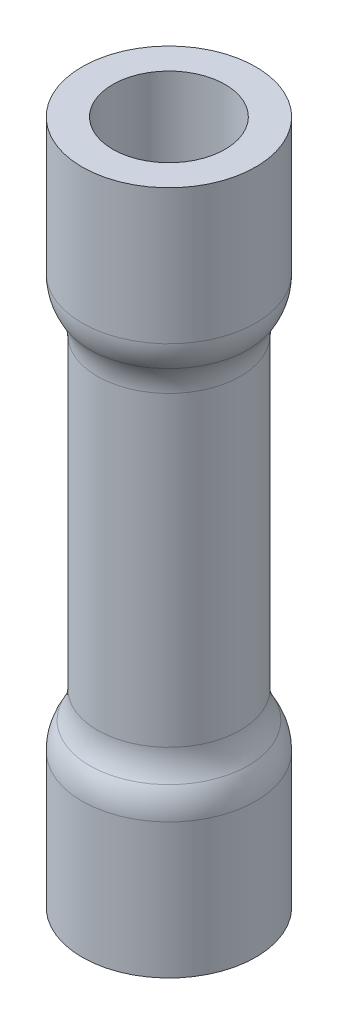
ISO-10303-21;
HEADER;
FILE_DESCRIPTION(('STEP AP214'),'2;1');
FILE_NAME('part.step','',(''),(''),'','','');
FILE_SCHEMA(('AUTOMOTIVE_DESIGN { 1 0 10303 214 1 1 1 1 }'));
ENDSEC;
DATA;
#1=APPLICATION_CONTEXT('core data for automotive mechanical design processes');
#2=APPLICATION_PROTOCOL_DEFINITION('international standard','automotive_design',2000,#1);
#3=PRODUCT_CONTEXT('',#1,'mechanical');
#4=PRODUCT('Part','Part','',(#3));
#5=PRODUCT_RELATED_PRODUCT_CATEGORY('part','',(#4));
#6=PRODUCT_DEFINITION_FORMATION('','',#4);
#7=PRODUCT_DEFINITION_CONTEXT('part definition',#1,'design');
#8=PRODUCT_DEFINITION('design','',#6,#7);
#9=PRODUCT_DEFINITION_SHAPE('','',#8);
#10=(LENGTH_UNIT() NAMED_UNIT(*) SI_UNIT(.MILLI.,.METRE.));
#11=(NAMED_UNIT(*) PLANE_ANGLE_UNIT() SI_UNIT($,.RADIAN.));
#12=(NAMED_UNIT(*) SI_UNIT($,.STERADIAN.) SOLID_ANGLE_UNIT());
#13=UNCERTAINTY_MEASURE_WITH_UNIT(LENGTH_MEASURE(1.E-05),#10,'distance_accuracy_value','');
#14=(GEOMETRIC_REPRESENTATION_CONTEXT(3) GLOBAL_UNCERTAINTY_ASSIGNED_CONTEXT((#13)) GLOBAL_UNIT_ASSIGNED_CONTEXT((#10,
#11,#12)) REPRESENTATION_CONTEXT('',''));
#15=CARTESIAN_POINT('',(0.,0.,0.));
#16=DIRECTION('',(0.,0.,1.));
#17=DIRECTION('',(1.,0.,0.));
#18=AXIS2_PLACEMENT_3D('',#15,#16,#17);
#19=CARTESIAN_POINT('',(0.,17.018,0.));
#20=DIRECTION('',(0.,1.,0.));
#21=DIRECTION('',(0.,0.,1.));
#22=AXIS2_PLACEMENT_3D('',#19,#20,#21);
#23=CYLINDRICAL_SURFACE('',#22,1.016);
#24=CARTESIAN_POINT('',(0.,12.319,0.));
#25=DIRECTION('',(0.,1.,0.));
#26=DIRECTION('',(0.,0.,1.));
#27=AXIS2_PLACEMENT_3D('',#24,#25,#26);
#28=CIRCLE('',#27,1.016);
#29=CARTESIAN_POINT('',(0.,12.319,1.016));
#30=VERTEX_POINT('',#29);
#31=EDGE_CURVE('E114',#30,#30,#28,.F.);
#32=ORIENTED_EDGE('',*,*,#31,.F.);
#33=EDGE_LOOP('',(#32));
#34=FACE_BOUND('',#33,.T.);
#35=CARTESIAN_POINT('',(0.,4.699,0.));
#36=DIRECTION('',(0.,1.,0.));
#37=DIRECTION('',(0.,0.,1.));
#38=AXIS2_PLACEMENT_3D('',#35,#36,#37);
#39=CIRCLE('',#38,1.016);
#40=CARTESIAN_POINT('',(0.,4.699,1.016));
#41=VERTEX_POINT('',#40);
#42=EDGE_CURVE('E117',#41,#41,#39,.T.);
#43=ORIENTED_EDGE('',*,*,#42,.F.);
#44=EDGE_LOOP('',(#43));
#45=FACE_BOUND('',#44,.T.);
#46=ADVANCED_FACE('F12',(#34,#45),#23,.F.);
#47=CARTESIAN_POINT('',(0.,4.699,0.));
#48=DIRECTION('',(0.,1.,0.));
#49=DIRECTION('',(0.,0.,1.));
#50=AXIS2_PLACEMENT_3D('',#47,#48,#49);
#51=TOROIDAL_SURFACE('',#50,3.048,2.032);
#52=ORIENTED_EDGE('',*,*,#42,.T.);
#53=EDGE_LOOP('',(#52));
#54=FACE_BOUND('',#53,.T.);
#55=CARTESIAN_POINT('',(0.,3.62857757871017,0.));
#56=DIRECTION('',(0.,1.,0.));
#57=DIRECTION('',(0.,0.,1.));
#58=AXIS2_PLACEMENT_3D('',#55,#56,#57);
#59=CIRCLE('',#58,1.3208);
#60=CARTESIAN_POINT('',(0.,3.62857757871017,1.3208));
#61=VERTEX_POINT('',#60);
#62=EDGE_CURVE('E113',#61,#61,#59,.F.);
#63=ORIENTED_EDGE('',*,*,#62,.T.);
#64=EDGE_LOOP('',(#63));
#65=FACE_BOUND('',#64,.T.);
#66=ADVANCED_FACE('F106',(#54,#65),#51,.T.);
#67=CARTESIAN_POINT('',(0.,12.319,0.));
#68=DIRECTION('',(0.,1.,0.));
#69=DIRECTION('',(0.,0.,1.));
#70=AXIS2_PLACEMENT_3D('',#67,#68,#69);
#71=TOROIDAL_SURFACE('',#70,3.048,2.032);
#72=CARTESIAN_POINT('',(0.,13.3894224212898,0.));
#73=DIRECTION('',(0.,1.,0.));
#74=DIRECTION('',(0.,0.,1.));
#75=AXIS2_PLACEMENT_3D('',#72,#73,#74);
#76=CIRCLE('',#75,1.3208);
#77=CARTESIAN_POINT('',(0.,13.3894224212898,1.3208));
#78=VERTEX_POINT('',#77);
#79=EDGE_CURVE('E98',#78,#78,#76,.T.);
#80=ORIENTED_EDGE('',*,*,#79,.T.);
#81=EDGE_LOOP('',(#80));
#82=FACE_BOUND('',#81,.T.);
#83=ORIENTED_EDGE('',*,*,#31,.T.);
#84=EDGE_LOOP('',(#83));
#85=FACE_BOUND('',#84,.T.);
#86=ADVANCED_FACE('F104',(#82,#85),#71,.T.);
#87=CARTESIAN_POINT('',(0.,3.36097197338771,0.));
#88=DIRECTION('',(0.,1.,0.));
#89=DIRECTION('',(0.,0.,1.));
#90=AXIS2_PLACEMENT_3D('',#87,#88,#89);
#91=TOROIDAL_SURFACE('',#90,0.888999999999999,0.508000000000001);
#92=ORIENTED_EDGE('',*,*,#62,.F.);
#93=EDGE_LOOP('',(#92));
#94=FACE_BOUND('',#93,.T.);
#95=CARTESIAN_POINT('',(0.,3.36097197338771,0.));
#96=DIRECTION('',(0.,1.,0.));
#97=DIRECTION('',(0.,0.,1.));
#98=AXIS2_PLACEMENT_3D('',#95,#96,#97);
#99=CIRCLE('',#98,1.397);
#100=CARTESIAN_POINT('',(0.,3.36097197338771,1.397));
#101=VERTEX_POINT('',#100);
#102=EDGE_CURVE('E96',#101,#101,#99,.F.);
#103=ORIENTED_EDGE('',*,*,#102,.T.);
#104=EDGE_LOOP('',(#103));
#105=FACE_BOUND('',#104,.T.);
#106=ADVANCED_FACE('F87',(#94,#105),#91,.F.);
#107=CARTESIAN_POINT('',(0.,13.6570280266123,0.));
#108=DIRECTION('',(0.,1.,0.));
#109=DIRECTION('',(0.,0.,1.));
#110=AXIS2_PLACEMENT_3D('',#107,#108,#109);
#111=TOROIDAL_SURFACE('',#110,0.888999999999999,0.508);
#112=CARTESIAN_POINT('',(0.,13.6570280266123,0.));
#113=DIRECTION('',(0.,1.,0.));
#114=DIRECTION('',(0.,0.,1.));
#115=AXIS2_PLACEMENT_3D('',#112,#113,#114);
#116=CIRCLE('',#115,1.397);
#117=CARTESIAN_POINT('',(0.,13.6570280266123,1.397));
#118=VERTEX_POINT('',#117);
#119=EDGE_CURVE('E93',#118,#118,#116,.T.);
#120=ORIENTED_EDGE('',*,*,#119,.T.);
#121=EDGE_LOOP('',(#120));
#122=FACE_BOUND('',#121,.T.);
#123=ORIENTED_EDGE('',*,*,#79,.F.);
#124=EDGE_LOOP('',(#123));
#125=FACE_BOUND('',#124,.T.);
#126=ADVANCED_FACE('F82',(#122,#125),#111,.F.);
#127=CARTESIAN_POINT('',(0.,17.018,0.));
#128=DIRECTION('',(0.,1.,0.));
#129=DIRECTION('',(0.,0.,1.));
#130=AXIS2_PLACEMENT_3D('',#127,#128,#129);
#131=CYLINDRICAL_SURFACE('',#130,1.397);
#132=ORIENTED_EDGE('',*,*,#102,.F.);
#133=EDGE_LOOP('',(#132));
#134=FACE_BOUND('',#133,.T.);
#135=CARTESIAN_POINT('',(0.,0.,0.));
#136=DIRECTION('',(0.,1.,0.));
#137=DIRECTION('',(0.,0.,1.));
#138=AXIS2_PLACEMENT_3D('',#135,#136,#137);
#139=CIRCLE('',#138,1.397);
#140=CARTESIAN_POINT('',(0.,0.,1.397));
#141=VERTEX_POINT('',#140);
#142=EDGE_CURVE('E15',#141,#141,#139,.T.);
#143=ORIENTED_EDGE('',*,*,#142,.F.);
#144=EDGE_LOOP('',(#143));
#145=FACE_BOUND('',#144,.T.);
#146=ADVANCED_FACE('F78',(#134,#145),#131,.F.);
#147=CARTESIAN_POINT('',(0.,17.018,0.));
#148=DIRECTION('',(0.,1.,0.));
#149=DIRECTION('',(0.,0.,1.));
#150=AXIS2_PLACEMENT_3D('',#147,#148,#149);
#151=CYLINDRICAL_SURFACE('',#150,1.397);
#152=CARTESIAN_POINT('',(0.,17.018,0.));
#153=DIRECTION('',(0.,1.,0.));
#154=DIRECTION('',(0.,0.,1.));
#155=AXIS2_PLACEMENT_3D('',#152,#153,#154);
#156=CIRCLE('',#155,1.397);
#157=CARTESIAN_POINT('',(0.,17.018,1.397));
#158=VERTEX_POINT('',#157);
#159=EDGE_CURVE('E125',#158,#158,#156,.F.);
#160=ORIENTED_EDGE('',*,*,#159,.F.);
#161=EDGE_LOOP('',(#160));
#162=FACE_BOUND('',#161,.T.);
#163=ORIENTED_EDGE('',*,*,#119,.F.);
#164=EDGE_LOOP('',(#163));
#165=FACE_BOUND('',#164,.T.);
#166=ADVANCED_FACE('F74',(#162,#165),#151,.F.);
#167=CARTESIAN_POINT('',(2.159,0.,0.));
#168=DIRECTION('',(0.,-1.,0.));
#169=DIRECTION('',(0.,0.,-1.));
#170=AXIS2_PLACEMENT_3D('',#167,#168,#169);
#171=PLANE('',#170);
#172=CARTESIAN_POINT('',(0.,0.,0.));
#173=DIRECTION('',(0.,1.,0.));
#174=DIRECTION('',(0.,0.,1.));
#175=AXIS2_PLACEMENT_3D('',#172,#173,#174);
#176=CIRCLE('',#175,2.159);
#177=CARTESIAN_POINT('',(0.,0.,2.159));
#178=VERTEX_POINT('',#177);
#179=EDGE_CURVE('E123',#178,#178,#176,.T.);
#180=ORIENTED_EDGE('',*,*,#179,.F.);
#181=EDGE_LOOP('',(#180));
#182=FACE_BOUND('',#181,.T.);
#183=ORIENTED_EDGE('',*,*,#142,.T.);
#184=EDGE_LOOP('',(#183));
#185=FACE_BOUND('',#184,.T.);
#186=ADVANCED_FACE('F70',(#182,#185),#171,.T.);
#187=CARTESIAN_POINT('',(1.397,17.018,0.));
#188=DIRECTION('',(0.,1.,0.));
#189=DIRECTION('',(0.,0.,1.));
#190=AXIS2_PLACEMENT_3D('',#187,#188,#189);
#191=PLANE('',#190);
#192=ORIENTED_EDGE('',*,*,#159,.T.);
#193=EDGE_LOOP('',(#192));
#194=FACE_BOUND('',#193,.T.);
#195=CARTESIAN_POINT('',(0.,17.018,0.));
#196=DIRECTION('',(0.,1.,0.));
#197=DIRECTION('',(0.,0.,1.));
#198=AXIS2_PLACEMENT_3D('',#195,#196,#197);
#199=CIRCLE('',#198,2.159);
#200=CARTESIAN_POINT('',(0.,17.018,2.159));
#201=VERTEX_POINT('',#200);
#202=EDGE_CURVE('E120',#201,#201,#199,.F.);
#203=ORIENTED_EDGE('',*,*,#202,.F.);
#204=EDGE_LOOP('',(#203));
#205=FACE_BOUND('',#204,.T.);
#206=ADVANCED_FACE('F66',(#194,#205),#191,.T.);
#207=CARTESIAN_POINT('',(0.,17.018,0.));
#208=DIRECTION('',(0.,1.,0.));
#209=DIRECTION('',(0.,0.,1.));
#210=AXIS2_PLACEMENT_3D('',#207,#208,#209);
#211=CYLINDRICAL_SURFACE('',#210,2.159);
#212=CARTESIAN_POINT('',(0.,3.36097197338771,0.));
#213=DIRECTION('',(0.,1.,0.));
#214=DIRECTION('',(0.,0.,1.));
#215=AXIS2_PLACEMENT_3D('',#212,#213,#214);
#216=CIRCLE('',#215,2.159);
#217=CARTESIAN_POINT('',(0.,3.36097197338771,2.159));
#218=VERTEX_POINT('',#217);
#219=EDGE_CURVE('E53',#218,#218,#216,.T.);
#220=ORIENTED_EDGE('',*,*,#219,.F.);
#221=EDGE_LOOP('',(#220));
#222=FACE_BOUND('',#221,.T.);
#223=ORIENTED_EDGE('',*,*,#179,.T.);
#224=EDGE_LOOP('',(#223));
#225=FACE_BOUND('',#224,.T.);
#226=ADVANCED_FACE('F62',(#222,#225),#211,.T.);
#227=CARTESIAN_POINT('',(0.,17.018,0.));
#228=DIRECTION('',(0.,1.,0.));
#229=DIRECTION('',(0.,0.,1.));
#230=AXIS2_PLACEMENT_3D('',#227,#228,#229);
#231=CYLINDRICAL_SURFACE('',#230,2.159);
#232=ORIENTED_EDGE('',*,*,#202,.T.);
#233=EDGE_LOOP('',(#232));
#234=FACE_BOUND('',#233,.T.);
#235=CARTESIAN_POINT('',(0.,13.6570280266123,0.));
#236=DIRECTION('',(0.,1.,0.));
#237=DIRECTION('',(0.,0.,1.));
#238=AXIS2_PLACEMENT_3D('',#235,#236,#237);
#239=CIRCLE('',#238,2.159);
#240=CARTESIAN_POINT('',(0.,13.6570280266123,2.159));
#241=VERTEX_POINT('',#240);
#242=EDGE_CURVE('E48',#241,#241,#239,.F.);
#243=ORIENTED_EDGE('',*,*,#242,.F.);
#244=EDGE_LOOP('',(#243));
#245=FACE_BOUND('',#244,.T.);
#246=ADVANCED_FACE('F58',(#234,#245),#231,.T.);
#247=CARTESIAN_POINT('',(0.,3.36097197338771,0.888999999999999));
#248=DIRECTION('',(1.,0.,0.));
#249=DIRECTION('',(0.,0.,1.));
#250=AXIS2_PLACEMENT_3D('',#247,#248,#249);
#251=CIRCLE('',#250,1.27);
#252=TRIMMED_CURVE('',#251,(PARAMETER_VALUE(-2.34619382340565)),
(PARAMETER_VALUE(2.34619382340565)),.T.,.PARAMETER.);
#253=CARTESIAN_POINT('',(0.,3.36097197338771,0.));
#254=DIRECTION('',(0.,1.,0.));
#255=AXIS1_PLACEMENT('',#253,#254);
#256=SURFACE_OF_REVOLUTION('',#252,#255);
#257=CARTESIAN_POINT('',(0.,4.02998598669385,0.));
#258=DIRECTION('',(0.,1.,0.));
#259=DIRECTION('',(0.,0.,1.));
#260=AXIS2_PLACEMENT_3D('',#257,#258,#259);
#261=CIRCLE('',#260,1.9685);
#262=CARTESIAN_POINT('',(0.,4.02998598669385,1.9685));
#263=VERTEX_POINT('',#262);
#264=EDGE_CURVE('E46',#263,#263,#261,.F.);
#265=ORIENTED_EDGE('',*,*,#264,.T.);
#266=EDGE_LOOP('',(#265));
#267=FACE_BOUND('',#266,.T.);
#268=ORIENTED_EDGE('',*,*,#219,.T.);
#269=EDGE_LOOP('',(#268));
#270=FACE_BOUND('',#269,.T.);
#271=ADVANCED_FACE('F55',(#267,#270),#256,.F.);
#272=CARTESIAN_POINT('',(0.,13.6570280266123,0.888999999999999));
#273=DIRECTION('',(1.,0.,0.));
#274=DIRECTION('',(0.,0.,1.));
#275=AXIS2_PLACEMENT_3D('',#272,#273,#274);
#276=CIRCLE('',#275,1.27);
#277=TRIMMED_CURVE('',#276,(PARAMETER_VALUE(-2.34619382340565)),
(PARAMETER_VALUE(2.34619382340565)),.T.,.PARAMETER.);
#278=CARTESIAN_POINT('',(0.,13.6570280266123,0.));
#279=DIRECTION('',(0.,1.,0.));
#280=AXIS1_PLACEMENT('',#278,#279);
#281=SURFACE_OF_REVOLUTION('',#277,#280);
#282=ORIENTED_EDGE('',*,*,#242,.T.);
#283=EDGE_LOOP('',(#282));
#284=FACE_BOUND('',#283,.T.);
#285=CARTESIAN_POINT('',(0.,12.9880140133061,0.));
#286=DIRECTION('',(0.,1.,0.));
#287=DIRECTION('',(0.,0.,1.));
#288=AXIS2_PLACEMENT_3D('',#285,#286,#287);
#289=CIRCLE('',#288,1.9685);
#290=CARTESIAN_POINT('',(0.,12.9880140133061,1.9685));
#291=VERTEX_POINT('',#290);
#292=EDGE_CURVE('E24',#291,#291,#289,.T.);
#293=ORIENTED_EDGE('',*,*,#292,.T.);
#294=EDGE_LOOP('',(#293));
#295=FACE_BOUND('',#294,.T.);
#296=ADVANCED_FACE('F40',(#284,#295),#281,.F.);
#297=CARTESIAN_POINT('',(0.,4.699,0.));
#298=DIRECTION('',(0.,1.,0.));
#299=DIRECTION('',(0.,0.,1.));
#300=AXIS2_PLACEMENT_3D('',#297,#298,#299);
#301=TOROIDAL_SURFACE('',#300,3.048,1.27);
#302=CARTESIAN_POINT('',(0.,4.699,0.));
#303=DIRECTION('',(0.,1.,0.));
#304=DIRECTION('',(0.,0.,1.));
#305=AXIS2_PLACEMENT_3D('',#302,#303,#304);
#306=CIRCLE('',#305,1.778);
#307=CARTESIAN_POINT('',(0.,4.699,1.778));
#308=VERTEX_POINT('',#307);
#309=EDGE_CURVE('E19',#308,#308,#306,.T.);
#310=ORIENTED_EDGE('',*,*,#309,.F.);
#311=EDGE_LOOP('',(#310));
#312=FACE_BOUND('',#311,.T.);
#313=ORIENTED_EDGE('',*,*,#264,.F.);
#314=EDGE_LOOP('',(#313));
#315=FACE_BOUND('',#314,.T.);
#316=ADVANCED_FACE('F36',(#312,#315),#301,.F.);
#317=CARTESIAN_POINT('',(0.,12.319,0.));
#318=DIRECTION('',(0.,1.,0.));
#319=DIRECTION('',(0.,0.,1.));
#320=AXIS2_PLACEMENT_3D('',#317,#318,#319);
#321=TOROIDAL_SURFACE('',#320,3.048,1.27);
#322=ORIENTED_EDGE('',*,*,#292,.F.);
#323=EDGE_LOOP('',(#322));
#324=FACE_BOUND('',#323,.T.);
#325=CARTESIAN_POINT('',(0.,12.319,0.));
#326=DIRECTION('',(0.,1.,0.));
#327=DIRECTION('',(0.,0.,1.));
#328=AXIS2_PLACEMENT_3D('',#325,#326,#327);
#329=CIRCLE('',#328,1.778);
#330=CARTESIAN_POINT('',(0.,12.319,1.778));
#331=VERTEX_POINT('',#330);
#332=EDGE_CURVE('E8',#331,#331,#329,.F.);
#333=ORIENTED_EDGE('',*,*,#332,.F.);
#334=EDGE_LOOP('',(#333));
#335=FACE_BOUND('',#334,.T.);
#336=ADVANCED_FACE('F31',(#324,#335),#321,.F.);
#337=CARTESIAN_POINT('',(0.,17.018,0.));
#338=DIRECTION('',(0.,1.,0.));
#339=DIRECTION('',(0.,0.,1.));
#340=AXIS2_PLACEMENT_3D('',#337,#338,#339);
#341=CYLINDRICAL_SURFACE('',#340,1.778);
#342=ORIENTED_EDGE('',*,*,#332,.T.);
#343=EDGE_LOOP('',(#342));
#344=FACE_BOUND('',#343,.T.);
#345=ORIENTED_EDGE('',*,*,#309,.T.);
#346=EDGE_LOOP('',(#345));
#347=FACE_BOUND('',#346,.T.);
#348=ADVANCED_FACE('F35',(#344,#347),#341,.T.);
#349=CLOSED_SHELL('',(#46,#66,#86,#106,#126,#146,#166,#186,#206,#226,#246,#271,#296,#316,#336,#348));
#350=MANIFOLD_SOLID_BREP('B1',#349);
#351=ADVANCED_BREP_SHAPE_REPRESENTATION('',(#18,#350),#14);
#352=SHAPE_DEFINITION_REPRESENTATION(#9,#351);
ENDSEC;
END-ISO-10303-21;
